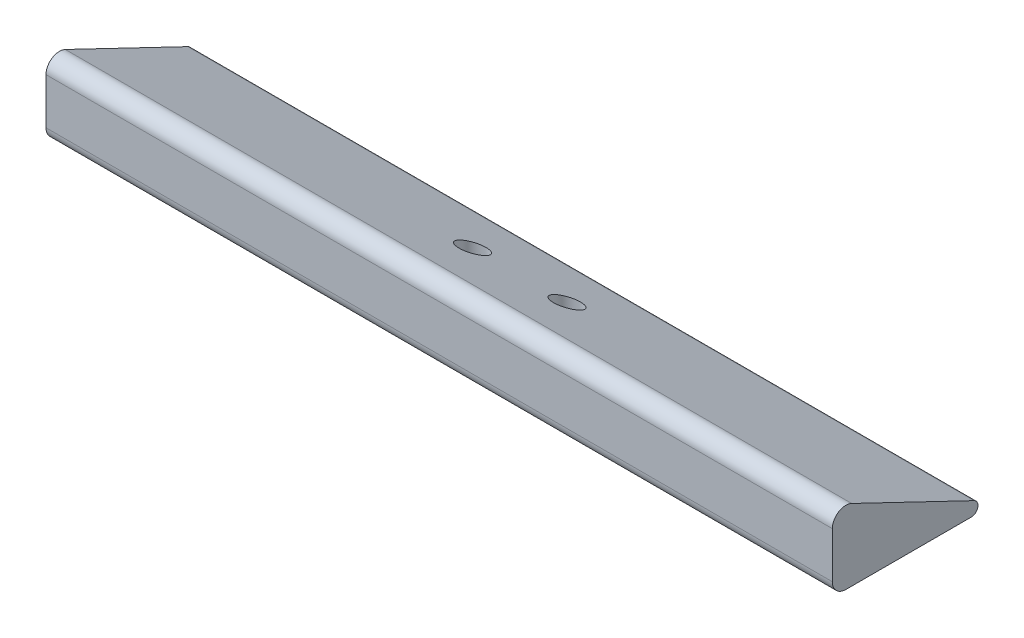
ISO-10303-21;
HEADER;
FILE_DESCRIPTION(('STEP AP214'),'2;1');
FILE_NAME('part.step','',(''),(''),'','','');
FILE_SCHEMA(('AUTOMOTIVE_DESIGN { 1 0 10303 214 1 1 1 1 }'));
ENDSEC;
DATA;
#1=APPLICATION_CONTEXT('core data for automotive mechanical design processes');
#2=APPLICATION_PROTOCOL_DEFINITION('international standard','automotive_design',2000,#1);
#3=PRODUCT_CONTEXT('',#1,'mechanical');
#4=PRODUCT('Part','Part','',(#3));
#5=PRODUCT_RELATED_PRODUCT_CATEGORY('part','',(#4));
#6=PRODUCT_DEFINITION_FORMATION('','',#4);
#7=PRODUCT_DEFINITION_CONTEXT('part definition',#1,'design');
#8=PRODUCT_DEFINITION('design','',#6,#7);
#9=PRODUCT_DEFINITION_SHAPE('','',#8);
#10=(LENGTH_UNIT() NAMED_UNIT(*) SI_UNIT(.MILLI.,.METRE.));
#11=(NAMED_UNIT(*) PLANE_ANGLE_UNIT() SI_UNIT($,.RADIAN.));
#12=(NAMED_UNIT(*) SI_UNIT($,.STERADIAN.) SOLID_ANGLE_UNIT());
#13=UNCERTAINTY_MEASURE_WITH_UNIT(LENGTH_MEASURE(1.E-05),#10,'distance_accuracy_value','');
#14=(GEOMETRIC_REPRESENTATION_CONTEXT(3) GLOBAL_UNCERTAINTY_ASSIGNED_CONTEXT((#13)) GLOBAL_UNIT_ASSIGNED_CONTEXT((#10,
#11,#12)) REPRESENTATION_CONTEXT('',''));
#15=CARTESIAN_POINT('',(0.,0.,0.));
#16=DIRECTION('',(0.,0.,1.));
#17=DIRECTION('',(1.,0.,0.));
#18=AXIS2_PLACEMENT_3D('',#15,#16,#17);
#19=CARTESIAN_POINT('',(116.65,8.82153206018207,-2.));
#20=DIRECTION('',(-1.,0.,0.));
#21=DIRECTION('',(0.,0.,1.));
#22=AXIS2_PLACEMENT_3D('',#19,#20,#21);
#23=CYLINDRICAL_SURFACE('',#22,2.);
#24=CARTESIAN_POINT('',(0.,8.82153206018207,-2.));
#25=DIRECTION('',(1.,0.,0.));
#26=DIRECTION('',(0.,0.,1.));
#27=AXIS2_PLACEMENT_3D('',#24,#25,#26);
#28=CIRCLE('',#27,2.);
#29=CARTESIAN_POINT('',(0.,10.6245781751186,-2.86546213516954));
#30=VERTEX_POINT('',#29);
#31=CARTESIAN_POINT('',(0.,8.82153206018207,0.));
#32=VERTEX_POINT('',#31);
#33=EDGE_CURVE('E129',#30,#32,#28,.T.);
#34=ORIENTED_EDGE('',*,*,#33,.T.);
#35=DIRECTION('',(-1.,0.,0.));
#36=VECTOR('',#35,1.);
#37=CARTESIAN_POINT('',(116.65,8.82153206018207,0.));
#38=LINE('',#37,#36);
#39=CARTESIAN_POINT('',(116.65,8.82153206018207,0.));
#40=VERTEX_POINT('',#39);
#41=EDGE_CURVE('E11',#40,#32,#38,.T.);
#42=ORIENTED_EDGE('',*,*,#41,.F.);
#43=CARTESIAN_POINT('',(116.65,8.82153206018207,-2.));
#44=DIRECTION('',(1.,0.,0.));
#45=DIRECTION('',(0.,0.,1.));
#46=AXIS2_PLACEMENT_3D('',#43,#44,#45);
#47=CIRCLE('',#46,2.);
#48=CARTESIAN_POINT('',(116.65,10.6245781751186,-2.86546213516954));
#49=VERTEX_POINT('',#48);
#50=EDGE_CURVE('E139',#49,#40,#47,.T.);
#51=ORIENTED_EDGE('',*,*,#50,.F.);
#52=DIRECTION('',(-1.,0.,0.));
#53=VECTOR('',#52,1.);
#54=CARTESIAN_POINT('',(116.65,10.6245781751186,-2.86546213516954));
#55=LINE('',#54,#53);
#56=EDGE_CURVE('E125',#49,#30,#55,.T.);
#57=ORIENTED_EDGE('',*,*,#56,.T.);
#58=EDGE_LOOP('',(#34,#42,#51,#57));
#59=FACE_BOUND('',#58,.T.);
#60=ADVANCED_FACE('F43',(#59),#23,.T.);
#61=CARTESIAN_POINT('',(116.65,8.82153206018207,0.));
#62=DIRECTION('',(0.,0.,-1.));
#63=DIRECTION('',(-1.,0.,0.));
#64=AXIS2_PLACEMENT_3D('',#61,#62,#63);
#65=PLANE('',#64);
#66=DIRECTION('',(0.,-1.,0.));
#67=VECTOR('',#66,1.);
#68=CARTESIAN_POINT('',(0.,8.82153206018207,0.));
#69=LINE('',#68,#67);
#70=CARTESIAN_POINT('',(0.,2.00000000000001,0.));
#71=VERTEX_POINT('',#70);
#72=EDGE_CURVE('E132',#32,#71,#69,.T.);
#73=ORIENTED_EDGE('',*,*,#72,.T.);
#74=DIRECTION('',(-1.,0.,0.));
#75=VECTOR('',#74,1.);
#76=CARTESIAN_POINT('',(116.65,2.00000000000001,0.));
#77=LINE('',#76,#75);
#78=CARTESIAN_POINT('',(116.65,2.00000000000001,0.));
#79=VERTEX_POINT('',#78);
#80=EDGE_CURVE('E52',#79,#71,#77,.T.);
#81=ORIENTED_EDGE('',*,*,#80,.F.);
#82=DIRECTION('',(0.,-1.,0.));
#83=VECTOR('',#82,1.);
#84=CARTESIAN_POINT('',(116.65,8.82153206018207,0.));
#85=LINE('',#84,#83);
#86=EDGE_CURVE('E98',#40,#79,#85,.T.);
#87=ORIENTED_EDGE('',*,*,#86,.F.);
#88=ORIENTED_EDGE('',*,*,#41,.T.);
#89=EDGE_LOOP('',(#73,#81,#87,#88));
#90=FACE_BOUND('',#89,.T.);
#91=ADVANCED_FACE('F165',(#90),#65,.F.);
#92=CARTESIAN_POINT('',(116.65,2.,-2.));
#93=DIRECTION('',(-1.,0.,0.));
#94=DIRECTION('',(0.,0.,1.));
#95=AXIS2_PLACEMENT_3D('',#92,#93,#94);
#96=CYLINDRICAL_SURFACE('',#95,2.);
#97=CARTESIAN_POINT('',(0.,2.,-2.));
#98=DIRECTION('',(1.,0.,0.));
#99=DIRECTION('',(0.,0.,1.));
#100=AXIS2_PLACEMENT_3D('',#97,#98,#99);
#101=CIRCLE('',#100,2.);
#102=CARTESIAN_POINT('',(0.,0.,-2.00000000000001));
#103=VERTEX_POINT('',#102);
#104=EDGE_CURVE('E134',#71,#103,#101,.T.);
#105=ORIENTED_EDGE('',*,*,#104,.T.);
#106=DIRECTION('',(-1.,0.,0.));
#107=VECTOR('',#106,1.);
#108=CARTESIAN_POINT('',(116.65,0.,-2.00000000000001));
#109=LINE('',#108,#107);
#110=CARTESIAN_POINT('',(116.65,0.,-2.00000000000001));
#111=VERTEX_POINT('',#110);
#112=EDGE_CURVE('E120',#111,#103,#109,.T.);
#113=ORIENTED_EDGE('',*,*,#112,.F.);
#114=CARTESIAN_POINT('',(116.65,2.,-2.));
#115=DIRECTION('',(1.,0.,0.));
#116=DIRECTION('',(0.,0.,1.));
#117=AXIS2_PLACEMENT_3D('',#114,#115,#116);
#118=CIRCLE('',#117,2.);
#119=EDGE_CURVE('E111',#79,#111,#118,.T.);
#120=ORIENTED_EDGE('',*,*,#119,.F.);
#121=ORIENTED_EDGE('',*,*,#80,.T.);
#122=EDGE_LOOP('',(#105,#113,#120,#121));
#123=FACE_BOUND('',#122,.T.);
#124=ADVANCED_FACE('F168',(#123),#96,.T.);
#125=CARTESIAN_POINT('',(116.65,0.,-2.00000000000001));
#126=DIRECTION('',(0.,1.,0.));
#127=DIRECTION('',(0.,0.,1.));
#128=AXIS2_PLACEMENT_3D('',#125,#126,#127);
#129=PLANE('',#128);
#130=CARTESIAN_POINT('',(51.325,0.,-11.951977882722));
#131=DIRECTION('',(0.,1.,0.));
#132=DIRECTION('',(0.,0.,1.));
#133=AXIS2_PLACEMENT_3D('',#130,#131,#132);
#134=CIRCLE('',#133,1.5);
#135=CARTESIAN_POINT('',(51.325,0.,-10.451977882722));
#136=VERTEX_POINT('',#135);
#137=EDGE_CURVE('E156',#136,#136,#134,.T.);
#138=ORIENTED_EDGE('',*,*,#137,.T.);
#139=EDGE_LOOP('',(#138));
#140=FACE_BOUND('',#139,.T.);
#141=CARTESIAN_POINT('',(65.325,0.,-11.951977882722));
#142=DIRECTION('',(0.,1.,0.));
#143=DIRECTION('',(0.,0.,1.));
#144=AXIS2_PLACEMENT_3D('',#141,#142,#143);
#145=CIRCLE('',#144,1.5);
#146=CARTESIAN_POINT('',(65.325,0.,-10.451977882722));
#147=VERTEX_POINT('',#146);
#148=EDGE_CURVE('E159',#147,#147,#145,.T.);
#149=ORIENTED_EDGE('',*,*,#148,.T.);
#150=EDGE_LOOP('',(#149));
#151=FACE_BOUND('',#150,.T.);
#152=DIRECTION('',(0.,0.,-1.));
#153=VECTOR('',#152,1.);
#154=CARTESIAN_POINT('',(0.,0.,-2.00000000000001));
#155=LINE('',#154,#153);
#156=CARTESIAN_POINT('',(0.,0.,-20.6057625626897));
#157=VERTEX_POINT('',#156);
#158=EDGE_CURVE('E119',#103,#157,#155,.T.);
#159=ORIENTED_EDGE('',*,*,#158,.T.);
#160=DIRECTION('',(-1.,0.,0.));
#161=VECTOR('',#160,1.);
#162=CARTESIAN_POINT('',(116.65,0.,-20.6057625626897));
#163=LINE('',#162,#161);
#164=CARTESIAN_POINT('',(116.65,0.,-20.6057625626897));
#165=VERTEX_POINT('',#164);
#166=EDGE_CURVE('E116',#165,#157,#163,.T.);
#167=ORIENTED_EDGE('',*,*,#166,.F.);
#168=DIRECTION('',(0.,0.,-1.));
#169=VECTOR('',#168,1.);
#170=CARTESIAN_POINT('',(116.65,0.,-2.00000000000001));
#171=LINE('',#170,#169);
#172=EDGE_CURVE('E105',#111,#165,#171,.T.);
#173=ORIENTED_EDGE('',*,*,#172,.F.);
#174=ORIENTED_EDGE('',*,*,#112,.T.);
#175=EDGE_LOOP('',(#159,#167,#173,#174));
#176=FACE_BOUND('',#175,.T.);
#177=ADVANCED_FACE('F117',(#140,#151,#176),#129,.F.);
#178=CARTESIAN_POINT('',(116.65,1.,-20.6057625626897));
#179=DIRECTION('',(-1.,0.,0.));
#180=DIRECTION('',(0.,0.,1.));
#181=AXIS2_PLACEMENT_3D('',#178,#179,#180);
#182=CYLINDRICAL_SURFACE('',#181,0.999999999999999);
#183=CARTESIAN_POINT('',(0.,1.,-20.6057625626897));
#184=DIRECTION('',(1.,0.,0.));
#185=DIRECTION('',(0.,0.,1.));
#186=AXIS2_PLACEMENT_3D('',#183,#184,#185);
#187=CIRCLE('',#186,0.999999999999999);
#188=CARTESIAN_POINT('',(0.,1.90152305746827,-21.0384936302744));
#189=VERTEX_POINT('',#188);
#190=EDGE_CURVE('E84',#157,#189,#187,.T.);
#191=ORIENTED_EDGE('',*,*,#190,.T.);
#192=DIRECTION('',(-1.,0.,0.));
#193=VECTOR('',#192,1.);
#194=CARTESIAN_POINT('',(116.65,1.90152305746827,-21.0384936302744));
#195=LINE('',#194,#193);
#196=CARTESIAN_POINT('',(116.65,1.90152305746827,-21.0384936302744));
#197=VERTEX_POINT('',#196);
#198=EDGE_CURVE('E121',#197,#189,#195,.T.);
#199=ORIENTED_EDGE('',*,*,#198,.F.);
#200=CARTESIAN_POINT('',(116.65,1.,-20.6057625626897));
#201=DIRECTION('',(1.,0.,0.));
#202=DIRECTION('',(0.,0.,1.));
#203=AXIS2_PLACEMENT_3D('',#200,#201,#202);
#204=CIRCLE('',#203,0.999999999999999);
#205=EDGE_CURVE('E109',#165,#197,#204,.T.);
#206=ORIENTED_EDGE('',*,*,#205,.F.);
#207=ORIENTED_EDGE('',*,*,#166,.T.);
#208=EDGE_LOOP('',(#191,#199,#206,#207));
#209=FACE_BOUND('',#208,.T.);
#210=ADVANCED_FACE('F123',(#209),#182,.T.);
#211=CARTESIAN_POINT('',(116.65,1.90152305746827,-21.0384936302744));
#212=DIRECTION('',(0.,-0.901523057468274,0.432731067584771));
#213=DIRECTION('',(0.,-0.432731067584771,-0.901523057468274));
#214=AXIS2_PLACEMENT_3D('',#211,#212,#213);
#215=PLANE('',#214);
#216=CARTESIAN_POINT('',(51.325,6.26305061629345,-11.951977882722));
#217=DIRECTION('',(0.,-0.901523057468274,0.432731067584771));
#218=DIRECTION('',(0.,0.432731067584772,0.901523057468274));
#219=AXIS2_PLACEMENT_3D('',#216,#217,#218);
#220=ELLIPSE('',#219,2.21846793981793,2.);
#221=CARTESIAN_POINT('',(51.325,7.22305061629345,-9.95197788272198));
#222=VERTEX_POINT('',#221);
#223=EDGE_CURVE('E46',#222,#222,#220,.T.);
#224=ORIENTED_EDGE('',*,*,#223,.T.);
#225=EDGE_LOOP('',(#224));
#226=FACE_BOUND('',#225,.T.);
#227=CARTESIAN_POINT('',(65.325,6.26305061629345,-11.951977882722));
#228=DIRECTION('',(0.,-0.901523057468274,0.432731067584771));
#229=DIRECTION('',(0.,0.432731067584772,0.901523057468274));
#230=AXIS2_PLACEMENT_3D('',#227,#228,#229);
#231=ELLIPSE('',#230,2.21846793981792,2.);
#232=CARTESIAN_POINT('',(65.325,7.22305061629345,-9.95197788272198));
#233=VERTEX_POINT('',#232);
#234=EDGE_CURVE('E144',#233,#233,#231,.T.);
#235=ORIENTED_EDGE('',*,*,#234,.T.);
#236=EDGE_LOOP('',(#235));
#237=FACE_BOUND('',#236,.T.);
#238=DIRECTION('',(0.,0.432731067584771,0.901523057468273));
#239=VECTOR('',#238,1.);
#240=CARTESIAN_POINT('',(0.,1.90152305746827,-21.0384936302744));
#241=LINE('',#240,#239);
#242=EDGE_CURVE('E90',#189,#30,#241,.T.);
#243=ORIENTED_EDGE('',*,*,#242,.T.);
#244=ORIENTED_EDGE('',*,*,#56,.F.);
#245=DIRECTION('',(0.,0.432731067584771,0.901523057468273));
#246=VECTOR('',#245,1.);
#247=CARTESIAN_POINT('',(116.65,1.90152305746827,-21.0384936302744));
#248=LINE('',#247,#246);
#249=EDGE_CURVE('E61',#197,#49,#248,.T.);
#250=ORIENTED_EDGE('',*,*,#249,.F.);
#251=ORIENTED_EDGE('',*,*,#198,.T.);
#252=EDGE_LOOP('',(#243,#244,#250,#251));
#253=FACE_BOUND('',#252,.T.);
#254=ADVANCED_FACE('F173',(#226,#237,#253),#215,.F.);
#255=CARTESIAN_POINT('',(116.65,8.82153206018207,-2.));
#256=DIRECTION('',(-1.,0.,0.));
#257=DIRECTION('',(0.,0.,1.));
#258=AXIS2_PLACEMENT_3D('',#255,#256,#257);
#259=PLANE('',#258);
#260=ORIENTED_EDGE('',*,*,#50,.T.);
#261=ORIENTED_EDGE('',*,*,#86,.T.);
#262=ORIENTED_EDGE('',*,*,#119,.T.);
#263=ORIENTED_EDGE('',*,*,#172,.T.);
#264=ORIENTED_EDGE('',*,*,#205,.T.);
#265=ORIENTED_EDGE('',*,*,#249,.T.);
#266=EDGE_LOOP('',(#260,#261,#262,#263,#264,#265));
#267=FACE_BOUND('',#266,.T.);
#268=ADVANCED_FACE('F107',(#267),#259,.F.);
#269=CARTESIAN_POINT('',(0.,8.82153206018207,-2.));
#270=DIRECTION('',(-1.,0.,0.));
#271=DIRECTION('',(0.,0.,1.));
#272=AXIS2_PLACEMENT_3D('',#269,#270,#271);
#273=PLANE('',#272);
#274=ORIENTED_EDGE('',*,*,#33,.F.);
#275=ORIENTED_EDGE('',*,*,#242,.F.);
#276=ORIENTED_EDGE('',*,*,#190,.F.);
#277=ORIENTED_EDGE('',*,*,#158,.F.);
#278=ORIENTED_EDGE('',*,*,#104,.F.);
#279=ORIENTED_EDGE('',*,*,#72,.F.);
#280=EDGE_LOOP('',(#274,#275,#276,#277,#278,#279));
#281=FACE_BOUND('',#280,.T.);
#282=ADVANCED_FACE('F171',(#281),#273,.T.);
#283=CARTESIAN_POINT('',(65.325,2.,-11.951977882722));
#284=DIRECTION('',(0.,1.,0.));
#285=DIRECTION('',(0.,0.,1.));
#286=AXIS2_PLACEMENT_3D('',#283,#284,#285);
#287=CYLINDRICAL_SURFACE('',#286,2.);
#288=CARTESIAN_POINT('',(65.325,2.,-11.951977882722));
#289=DIRECTION('',(0.,1.,0.));
#290=DIRECTION('',(0.,0.,-1.));
#291=AXIS2_PLACEMENT_3D('',#288,#289,#290);
#292=CIRCLE('',#291,2.);
#293=CARTESIAN_POINT('',(65.325,2.,-13.951977882722));
#294=VERTEX_POINT('',#293);
#295=EDGE_CURVE('E151',#294,#294,#292,.T.);
#296=ORIENTED_EDGE('',*,*,#295,.F.);
#297=EDGE_LOOP('',(#296));
#298=FACE_BOUND('',#297,.T.);
#299=ORIENTED_EDGE('',*,*,#234,.F.);
#300=EDGE_LOOP('',(#299));
#301=FACE_BOUND('',#300,.T.);
#302=ADVANCED_FACE('F233',(#298,#301),#287,.F.);
#303=CARTESIAN_POINT('',(65.325,2.,-11.951977882722));
#304=DIRECTION('',(0.,-1.,0.));
#305=DIRECTION('',(0.,0.,-1.));
#306=AXIS2_PLACEMENT_3D('',#303,#304,#305);
#307=PLANE('',#306);
#308=CARTESIAN_POINT('',(65.325,2.,-11.951977882722));
#309=DIRECTION('',(0.,1.,0.));
#310=DIRECTION('',(0.,0.,1.));
#311=AXIS2_PLACEMENT_3D('',#308,#309,#310);
#312=CIRCLE('',#311,1.5);
#313=CARTESIAN_POINT('',(65.325,2.,-10.451977882722));
#314=VERTEX_POINT('',#313);
#315=EDGE_CURVE('E207',#314,#314,#312,.T.);
#316=ORIENTED_EDGE('',*,*,#315,.F.);
#317=EDGE_LOOP('',(#316));
#318=FACE_BOUND('',#317,.T.);
#319=ORIENTED_EDGE('',*,*,#295,.T.);
#320=EDGE_LOOP('',(#319));
#321=FACE_BOUND('',#320,.T.);
#322=ADVANCED_FACE('F228',(#318,#321),#307,.F.);
#323=CARTESIAN_POINT('',(51.325,2.,-11.951977882722));
#324=DIRECTION('',(0.,1.,0.));
#325=DIRECTION('',(0.,0.,1.));
#326=AXIS2_PLACEMENT_3D('',#323,#324,#325);
#327=CYLINDRICAL_SURFACE('',#326,2.);
#328=CARTESIAN_POINT('',(51.325,2.,-11.951977882722));
#329=DIRECTION('',(0.,1.,0.));
#330=DIRECTION('',(0.,0.,1.));
#331=AXIS2_PLACEMENT_3D('',#328,#329,#330);
#332=CIRCLE('',#331,2.);
#333=CARTESIAN_POINT('',(51.325,2.,-9.95197788272198));
#334=VERTEX_POINT('',#333);
#335=EDGE_CURVE('E146',#334,#334,#332,.T.);
#336=ORIENTED_EDGE('',*,*,#335,.F.);
#337=EDGE_LOOP('',(#336));
#338=FACE_BOUND('',#337,.T.);
#339=ORIENTED_EDGE('',*,*,#223,.F.);
#340=EDGE_LOOP('',(#339));
#341=FACE_BOUND('',#340,.T.);
#342=ADVANCED_FACE('F222',(#338,#341),#327,.F.);
#343=CARTESIAN_POINT('',(51.325,2.,-11.951977882722));
#344=DIRECTION('',(0.,1.,0.));
#345=DIRECTION('',(0.,0.,1.));
#346=AXIS2_PLACEMENT_3D('',#343,#344,#345);
#347=PLANE('',#346);
#348=CARTESIAN_POINT('',(51.325,2.,-11.951977882722));
#349=DIRECTION('',(0.,1.,0.));
#350=DIRECTION('',(0.,0.,1.));
#351=AXIS2_PLACEMENT_3D('',#348,#349,#350);
#352=CIRCLE('',#351,1.5);
#353=CARTESIAN_POINT('',(51.325,2.,-10.451977882722));
#354=VERTEX_POINT('',#353);
#355=EDGE_CURVE('E209',#354,#354,#352,.T.);
#356=ORIENTED_EDGE('',*,*,#355,.F.);
#357=EDGE_LOOP('',(#356));
#358=FACE_BOUND('',#357,.T.);
#359=ORIENTED_EDGE('',*,*,#335,.T.);
#360=EDGE_LOOP('',(#359));
#361=FACE_BOUND('',#360,.T.);
#362=ADVANCED_FACE('F219',(#358,#361),#347,.T.);
#363=CARTESIAN_POINT('',(65.325,0.,-11.951977882722));
#364=DIRECTION('',(0.,1.,0.));
#365=DIRECTION('',(0.,0.,1.));
#366=AXIS2_PLACEMENT_3D('',#363,#364,#365);
#367=CYLINDRICAL_SURFACE('',#366,1.5);
#368=ORIENTED_EDGE('',*,*,#148,.F.);
#369=EDGE_LOOP('',(#368));
#370=FACE_BOUND('',#369,.T.);
#371=ORIENTED_EDGE('',*,*,#315,.T.);
#372=EDGE_LOOP('',(#371));
#373=FACE_BOUND('',#372,.T.);
#374=ADVANCED_FACE('F221',(#370,#373),#367,.F.);
#375=CARTESIAN_POINT('',(51.325,0.,-11.951977882722));
#376=DIRECTION('',(0.,1.,0.));
#377=DIRECTION('',(0.,0.,1.));
#378=AXIS2_PLACEMENT_3D('',#375,#376,#377);
#379=CYLINDRICAL_SURFACE('',#378,1.5);
#380=ORIENTED_EDGE('',*,*,#137,.F.);
#381=EDGE_LOOP('',(#380));
#382=FACE_BOUND('',#381,.T.);
#383=ORIENTED_EDGE('',*,*,#355,.T.);
#384=EDGE_LOOP('',(#383));
#385=FACE_BOUND('',#384,.T.);
#386=ADVANCED_FACE('F217',(#382,#385),#379,.F.);
#387=CLOSED_SHELL('',(#60,#91,#124,#177,#210,#254,#268,#282,#302,#322,#342,#362,#374,#386));
#388=MANIFOLD_SOLID_BREP('B2',#387);
#389=ADVANCED_BREP_SHAPE_REPRESENTATION('',(#18,#388),#14);
#390=SHAPE_DEFINITION_REPRESENTATION(#9,#389);
ENDSEC;
END-ISO-10303-21;
